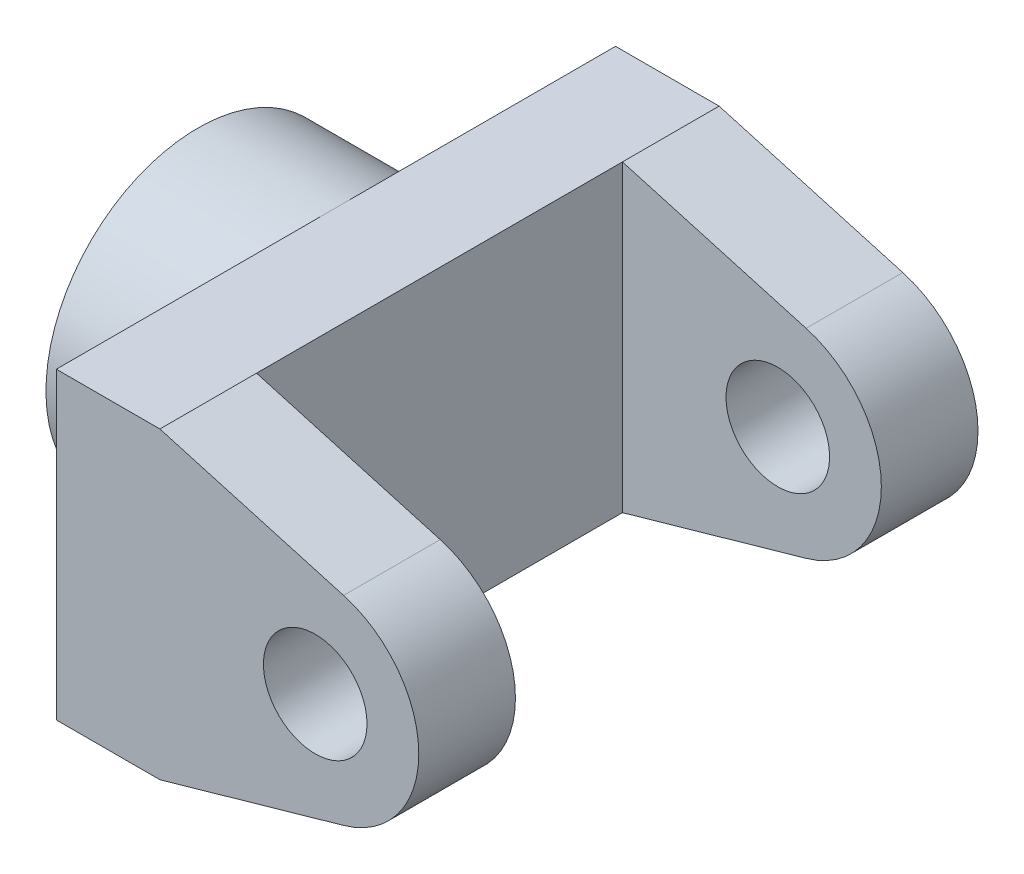
ISO-10303-21;
HEADER;
FILE_DESCRIPTION(('STEP AP214'),'2;1');
FILE_NAME('part.step','',(''),(''),'','','');
FILE_SCHEMA(('AUTOMOTIVE_DESIGN { 1 0 10303 214 1 1 1 1 }'));
ENDSEC;
DATA;
#1=APPLICATION_CONTEXT('core data for automotive mechanical design processes');
#2=APPLICATION_PROTOCOL_DEFINITION('international standard','automotive_design',2000,#1);
#3=PRODUCT_CONTEXT('',#1,'mechanical');
#4=PRODUCT('Part','Part','',(#3));
#5=PRODUCT_RELATED_PRODUCT_CATEGORY('part','',(#4));
#6=PRODUCT_DEFINITION_FORMATION('','',#4);
#7=PRODUCT_DEFINITION_CONTEXT('part definition',#1,'design');
#8=PRODUCT_DEFINITION('design','',#6,#7);
#9=PRODUCT_DEFINITION_SHAPE('','',#8);
#10=(LENGTH_UNIT() NAMED_UNIT(*) SI_UNIT(.MILLI.,.METRE.));
#11=(NAMED_UNIT(*) PLANE_ANGLE_UNIT() SI_UNIT($,.RADIAN.));
#12=(NAMED_UNIT(*) SI_UNIT($,.STERADIAN.) SOLID_ANGLE_UNIT());
#13=UNCERTAINTY_MEASURE_WITH_UNIT(LENGTH_MEASURE(1.E-05),#10,'distance_accuracy_value','');
#14=(GEOMETRIC_REPRESENTATION_CONTEXT(3) GLOBAL_UNCERTAINTY_ASSIGNED_CONTEXT((#13)) GLOBAL_UNIT_ASSIGNED_CONTEXT((#10,
#11,#12)) REPRESENTATION_CONTEXT('',''));
#15=CARTESIAN_POINT('',(0.,0.,0.));
#16=DIRECTION('',(0.,0.,1.));
#17=DIRECTION('',(1.,0.,0.));
#18=AXIS2_PLACEMENT_3D('',#15,#16,#17);
#19=CARTESIAN_POINT('',(-61.2064341570642,0.,107.796179541723));
#20=DIRECTION('',(-1.,0.,0.));
#21=DIRECTION('',(0.,-1.,0.));
#22=AXIS2_PLACEMENT_3D('',#19,#20,#21);
#23=PLANE('',#22);
#24=CARTESIAN_POINT('',(-61.2064341570642,0.,81.066179541723));
#25=DIRECTION('',(-1.,0.,0.));
#26=DIRECTION('',(0.,-1.,0.));
#27=AXIS2_PLACEMENT_3D('',#24,#25,#26);
#28=CIRCLE('',#27,14.52);
#29=CARTESIAN_POINT('',(-61.2064341570642,-14.52,81.066179541723));
#30=VERTEX_POINT('',#29);
#31=CARTESIAN_POINT('',(-61.2064341570642,14.52,81.066179541723));
#32=VERTEX_POINT('',#31);
#33=EDGE_CURVE('E48',#30,#32,#28,.T.);
#34=ORIENTED_EDGE('',*,*,#33,.F.);
#35=DIRECTION('',(0.,0.,-1.));
#36=VECTOR('',#35,1.);
#37=CARTESIAN_POINT('',(-61.2064341570642,-14.52,107.796179541723));
#38=LINE('',#37,#36);
#39=CARTESIAN_POINT('',(-61.2064341570642,-14.52,107.796179541723));
#40=VERTEX_POINT('',#39);
#41=EDGE_CURVE('E274',#40,#30,#38,.T.);
#42=ORIENTED_EDGE('',*,*,#41,.F.);
#43=DIRECTION('',(0.,1.,0.));
#44=VECTOR('',#43,1.);
#45=CARTESIAN_POINT('',(-61.2064341570642,0.,107.796179541723));
#46=LINE('',#45,#44);
#47=CARTESIAN_POINT('',(-61.2064341570642,14.52,107.796179541723));
#48=VERTEX_POINT('',#47);
#49=EDGE_CURVE('E242',#40,#48,#46,.T.);
#50=ORIENTED_EDGE('',*,*,#49,.T.);
#51=DIRECTION('',(0.,0.,-1.));
#52=VECTOR('',#51,1.);
#53=CARTESIAN_POINT('',(-61.2064341570642,14.52,107.796179541723));
#54=LINE('',#53,#52);
#55=EDGE_CURVE('E277',#48,#32,#54,.T.);
#56=ORIENTED_EDGE('',*,*,#55,.T.);
#57=EDGE_LOOP('',(#34,#42,#50,#56));
#58=FACE_BOUND('',#57,.T.);
#59=ADVANCED_FACE('F37',(#58),#23,.T.);
#60=CARTESIAN_POINT('',(-33.7462250281148,-9.52180479097105,107.796179541723));
#61=DIRECTION('',(-0.273758497873683,0.961798463734448,0.));
#62=DIRECTION('',(-0.961798463734448,-0.273758497873683,0.));
#63=AXIS2_PLACEMENT_3D('',#60,#61,#62);
#64=PLANE('',#63);
#65=DIRECTION('',(0.,0.,-1.));
#66=VECTOR('',#65,1.);
#67=CARTESIAN_POINT('',(-51.3064341570642,-14.52,107.796179541723));
#68=LINE('',#67,#66);
#69=CARTESIAN_POINT('',(-51.3064341570642,-14.52,107.796179541723));
#70=VERTEX_POINT('',#69);
#71=CARTESIAN_POINT('',(-51.3064341570642,-14.52,98.556179541723));
#72=VERTEX_POINT('',#71);
#73=EDGE_CURVE('E270',#70,#72,#68,.T.);
#74=ORIENTED_EDGE('',*,*,#73,.T.);
#75=DIRECTION('',(0.961798463734448,0.273758497873683,0.));
#76=VECTOR('',#75,1.);
#77=CARTESIAN_POINT('',(-33.7462250281148,-9.52180479097105,98.556179541723));
#78=LINE('',#77,#76);
#79=CARTESIAN_POINT('',(-33.7462250281148,-9.52180479097105,98.556179541723));
#80=VERTEX_POINT('',#79);
#81=EDGE_CURVE('E226',#72,#80,#78,.T.);
#82=ORIENTED_EDGE('',*,*,#81,.T.);
#83=DIRECTION('',(0.,0.,-1.));
#84=VECTOR('',#83,1.);
#85=CARTESIAN_POINT('',(-33.7462250281148,-9.52180479097105,107.796179541723));
#86=LINE('',#85,#84);
#87=CARTESIAN_POINT('',(-33.7462250281148,-9.52180479097105,107.796179541723));
#88=VERTEX_POINT('',#87);
#89=EDGE_CURVE('E46',#88,#80,#86,.T.);
#90=ORIENTED_EDGE('',*,*,#89,.F.);
#91=DIRECTION('',(0.961798463734448,0.273758497873683,0.));
#92=VECTOR('',#91,1.);
#93=CARTESIAN_POINT('',(-33.7462250281148,-9.52180479097105,107.796179541723));
#94=LINE('',#93,#92);
#95=EDGE_CURVE('E230',#70,#88,#94,.T.);
#96=ORIENTED_EDGE('',*,*,#95,.F.);
#97=EDGE_LOOP('',(#74,#82,#90,#96));
#98=FACE_BOUND('',#97,.T.);
#99=ADVANCED_FACE('F320',(#98),#64,.F.);
#100=CARTESIAN_POINT('',(-36.4564341570642,0.,107.796179541723));
#101=DIRECTION('',(0.,0.,-1.));
#102=DIRECTION('',(-1.,0.,0.));
#103=AXIS2_PLACEMENT_3D('',#100,#101,#102);
#104=CYLINDRICAL_SURFACE('',#103,9.9);
#105=CARTESIAN_POINT('',(-36.4564341570642,0.,98.556179541723));
#106=DIRECTION('',(0.,0.,1.));
#107=DIRECTION('',(1.,0.,0.));
#108=AXIS2_PLACEMENT_3D('',#105,#106,#107);
#109=CIRCLE('',#108,9.9);
#110=CARTESIAN_POINT('',(-33.7462250281148,9.52180479097103,98.556179541723));
#111=VERTEX_POINT('',#110);
#112=EDGE_CURVE('E224',#80,#111,#109,.T.);
#113=ORIENTED_EDGE('',*,*,#112,.T.);
#114=DIRECTION('',(0.,0.,-1.));
#115=VECTOR('',#114,1.);
#116=CARTESIAN_POINT('',(-33.7462250281148,9.52180479097103,107.796179541723));
#117=LINE('',#116,#115);
#118=CARTESIAN_POINT('',(-33.7462250281148,9.52180479097103,107.796179541723));
#119=VERTEX_POINT('',#118);
#120=EDGE_CURVE('E285',#119,#111,#117,.T.);
#121=ORIENTED_EDGE('',*,*,#120,.F.);
#122=CARTESIAN_POINT('',(-36.4564341570642,0.,107.796179541723));
#123=DIRECTION('',(0.,0.,1.));
#124=DIRECTION('',(1.,0.,0.));
#125=AXIS2_PLACEMENT_3D('',#122,#123,#124);
#126=CIRCLE('',#125,9.9);
#127=EDGE_CURVE('E233',#88,#119,#126,.T.);
#128=ORIENTED_EDGE('',*,*,#127,.F.);
#129=ORIENTED_EDGE('',*,*,#89,.T.);
#130=EDGE_LOOP('',(#113,#121,#128,#129));
#131=FACE_BOUND('',#130,.T.);
#132=ADVANCED_FACE('F328',(#131),#104,.T.);
#133=CARTESIAN_POINT('',(-33.7462250281148,9.52180479097103,107.796179541723));
#134=DIRECTION('',(0.273758497873682,0.961798463734448,0.));
#135=DIRECTION('',(-0.961798463734448,0.273758497873682,0.));
#136=AXIS2_PLACEMENT_3D('',#133,#134,#135);
#137=PLANE('',#136);
#138=DIRECTION('',(0.961798463734448,-0.273758497873682,0.));
#139=VECTOR('',#138,1.);
#140=CARTESIAN_POINT('',(-33.7462250281148,9.52180479097103,98.556179541723));
#141=LINE('',#140,#139);
#142=CARTESIAN_POINT('',(-51.3064341570642,14.52,98.556179541723));
#143=VERTEX_POINT('',#142);
#144=EDGE_CURVE('E221',#143,#111,#141,.T.);
#145=ORIENTED_EDGE('',*,*,#144,.F.);
#146=DIRECTION('',(0.,0.,-1.));
#147=VECTOR('',#146,1.);
#148=CARTESIAN_POINT('',(-51.3064341570642,14.52,107.796179541723));
#149=LINE('',#148,#147);
#150=CARTESIAN_POINT('',(-51.3064341570642,14.52,107.796179541723));
#151=VERTEX_POINT('',#150);
#152=EDGE_CURVE('E281',#151,#143,#149,.T.);
#153=ORIENTED_EDGE('',*,*,#152,.F.);
#154=DIRECTION('',(0.961798463734448,-0.273758497873682,0.));
#155=VECTOR('',#154,1.);
#156=CARTESIAN_POINT('',(-33.7462250281148,9.52180479097103,107.796179541723));
#157=LINE('',#156,#155);
#158=EDGE_CURVE('E236',#151,#119,#157,.T.);
#159=ORIENTED_EDGE('',*,*,#158,.T.);
#160=ORIENTED_EDGE('',*,*,#120,.T.);
#161=EDGE_LOOP('',(#145,#153,#159,#160));
#162=FACE_BOUND('',#161,.T.);
#163=ADVANCED_FACE('F351',(#162),#137,.T.);
#164=CARTESIAN_POINT('',(-36.4564341570642,0.,107.796179541723));
#165=DIRECTION('',(0.,0.,-1.));
#166=DIRECTION('',(-1.,0.,0.));
#167=AXIS2_PLACEMENT_3D('',#164,#165,#166);
#168=CYLINDRICAL_SURFACE('',#167,4.95);
#169=CARTESIAN_POINT('',(-36.4564341570642,0.,98.556179541723));
#170=DIRECTION('',(0.,0.,1.));
#171=DIRECTION('',(1.,0.,0.));
#172=AXIS2_PLACEMENT_3D('',#169,#170,#171);
#173=CIRCLE('',#172,4.95);
#174=CARTESIAN_POINT('',(-31.5064341570642,0.,98.556179541723));
#175=VERTEX_POINT('',#174);
#176=EDGE_CURVE('E41',#175,#175,#173,.T.);
#177=ORIENTED_EDGE('',*,*,#176,.F.);
#178=EDGE_LOOP('',(#177));
#179=FACE_BOUND('',#178,.T.);
#180=CARTESIAN_POINT('',(-36.4564341570642,0.,107.796179541723));
#181=DIRECTION('',(0.,0.,1.));
#182=DIRECTION('',(1.,0.,0.));
#183=AXIS2_PLACEMENT_3D('',#180,#181,#182);
#184=CIRCLE('',#183,4.95);
#185=CARTESIAN_POINT('',(-31.5064341570642,0.,107.796179541723));
#186=VERTEX_POINT('',#185);
#187=EDGE_CURVE('E247',#186,#186,#184,.T.);
#188=ORIENTED_EDGE('',*,*,#187,.T.);
#189=EDGE_LOOP('',(#188));
#190=FACE_BOUND('',#189,.T.);
#191=ADVANCED_FACE('F302',(#179,#190),#168,.F.);
#192=CARTESIAN_POINT('',(-33.7462250281148,-9.52180479097105,63.576179541723));
#193=VERTEX_POINT('',#192);
#194=CARTESIAN_POINT('',(-33.7462250281148,-9.52180479097105,54.336179541723));
#195=VERTEX_POINT('',#194);
#196=EDGE_CURVE('E288',#193,#195,#86,.T.);
#197=ORIENTED_EDGE('',*,*,#196,.F.);
#198=DIRECTION('',(-0.961798463734448,-0.273758497873683,0.));
#199=VECTOR('',#198,1.);
#200=CARTESIAN_POINT('',(-33.7462250281148,-9.52180479097105,63.576179541723));
#201=LINE('',#200,#199);
#202=CARTESIAN_POINT('',(-51.3064341570642,-14.52,63.576179541723));
#203=VERTEX_POINT('',#202);
#204=EDGE_CURVE('E218',#193,#203,#201,.T.);
#205=ORIENTED_EDGE('',*,*,#204,.T.);
#206=CARTESIAN_POINT('',(-51.3064341570642,-14.52,54.336179541723));
#207=VERTEX_POINT('',#206);
#208=EDGE_CURVE('E250',#203,#207,#68,.T.);
#209=ORIENTED_EDGE('',*,*,#208,.T.);
#210=DIRECTION('',(0.961798463734448,0.273758497873683,0.));
#211=VECTOR('',#210,1.);
#212=CARTESIAN_POINT('',(-33.7462250281148,-9.52180479097105,54.336179541723));
#213=LINE('',#212,#211);
#214=EDGE_CURVE('E229',#207,#195,#213,.T.);
#215=ORIENTED_EDGE('',*,*,#214,.T.);
#216=EDGE_LOOP('',(#197,#205,#209,#215));
#217=FACE_BOUND('',#216,.T.);
#218=ADVANCED_FACE('F39',(#217),#64,.F.);
#219=CARTESIAN_POINT('',(-33.7462250281148,9.52180479097103,63.576179541723));
#220=VERTEX_POINT('',#219);
#221=CARTESIAN_POINT('',(-33.7462250281148,9.52180479097103,54.336179541723));
#222=VERTEX_POINT('',#221);
#223=EDGE_CURVE('E284',#220,#222,#117,.T.);
#224=ORIENTED_EDGE('',*,*,#223,.F.);
#225=CARTESIAN_POINT('',(-36.4564341570642,0.,63.576179541723));
#226=DIRECTION('',(0.,0.,-1.));
#227=DIRECTION('',(-1.,0.,0.));
#228=AXIS2_PLACEMENT_3D('',#225,#226,#227);
#229=CIRCLE('',#228,9.9);
#230=EDGE_CURVE('E215',#220,#193,#229,.T.);
#231=ORIENTED_EDGE('',*,*,#230,.T.);
#232=ORIENTED_EDGE('',*,*,#196,.T.);
#233=CARTESIAN_POINT('',(-36.4564341570642,0.,54.336179541723));
#234=DIRECTION('',(0.,0.,1.));
#235=DIRECTION('',(1.,0.,0.));
#236=AXIS2_PLACEMENT_3D('',#233,#234,#235);
#237=CIRCLE('',#236,9.9);
#238=EDGE_CURVE('E253',#195,#222,#237,.T.);
#239=ORIENTED_EDGE('',*,*,#238,.T.);
#240=EDGE_LOOP('',(#224,#231,#232,#239));
#241=FACE_BOUND('',#240,.T.);
#242=ADVANCED_FACE('F348',(#241),#104,.T.);
#243=DIRECTION('',(-0.961798463734448,0.273758497873682,0.));
#244=VECTOR('',#243,1.);
#245=CARTESIAN_POINT('',(-33.7462250281148,9.52180479097103,63.576179541723));
#246=LINE('',#245,#244);
#247=CARTESIAN_POINT('',(-51.3064341570642,14.52,63.576179541723));
#248=VERTEX_POINT('',#247);
#249=EDGE_CURVE('E213',#220,#248,#246,.T.);
#250=ORIENTED_EDGE('',*,*,#249,.F.);
#251=ORIENTED_EDGE('',*,*,#223,.T.);
#252=DIRECTION('',(0.961798463734448,-0.273758497873682,0.));
#253=VECTOR('',#252,1.);
#254=CARTESIAN_POINT('',(-33.7462250281148,9.52180479097103,54.336179541723));
#255=LINE('',#254,#253);
#256=CARTESIAN_POINT('',(-51.3064341570642,14.52,54.336179541723));
#257=VERTEX_POINT('',#256);
#258=EDGE_CURVE('E256',#257,#222,#255,.T.);
#259=ORIENTED_EDGE('',*,*,#258,.F.);
#260=EDGE_CURVE('E280',#248,#257,#149,.T.);
#261=ORIENTED_EDGE('',*,*,#260,.F.);
#262=EDGE_LOOP('',(#250,#251,#259,#261));
#263=FACE_BOUND('',#262,.T.);
#264=ADVANCED_FACE('F343',(#263),#137,.T.);
#265=CARTESIAN_POINT('',(-36.4564341570642,14.52,107.796179541723));
#266=DIRECTION('',(0.,1.,0.));
#267=DIRECTION('',(-1.,0.,0.));
#268=AXIS2_PLACEMENT_3D('',#265,#266,#267);
#269=PLANE('',#268);
#270=DIRECTION('',(1.,0.,0.));
#271=VECTOR('',#270,1.);
#272=CARTESIAN_POINT('',(-36.4564341570642,14.52,54.336179541723));
#273=LINE('',#272,#271);
#274=CARTESIAN_POINT('',(-61.2064341570642,14.52,54.336179541723));
#275=VERTEX_POINT('',#274);
#276=EDGE_CURVE('E259',#275,#257,#273,.T.);
#277=ORIENTED_EDGE('',*,*,#276,.F.);
#278=EDGE_CURVE('E276',#32,#275,#54,.T.);
#279=ORIENTED_EDGE('',*,*,#278,.F.);
#280=ORIENTED_EDGE('',*,*,#55,.F.);
#281=DIRECTION('',(1.,0.,0.));
#282=VECTOR('',#281,1.);
#283=CARTESIAN_POINT('',(-36.4564341570642,14.52,107.796179541723));
#284=LINE('',#283,#282);
#285=EDGE_CURVE('E239',#48,#151,#284,.T.);
#286=ORIENTED_EDGE('',*,*,#285,.T.);
#287=ORIENTED_EDGE('',*,*,#152,.T.);
#288=DIRECTION('',(0.,0.,-1.));
#289=VECTOR('',#288,1.);
#290=CARTESIAN_POINT('',(-51.3064341570642,14.52,98.556179541723));
#291=LINE('',#290,#289);
#292=EDGE_CURVE('E203',#143,#248,#291,.T.);
#293=ORIENTED_EDGE('',*,*,#292,.T.);
#294=ORIENTED_EDGE('',*,*,#260,.T.);
#295=EDGE_LOOP('',(#277,#279,#280,#286,#287,#293,#294));
#296=FACE_BOUND('',#295,.T.);
#297=ADVANCED_FACE('F337',(#296),#269,.T.);
#298=EDGE_CURVE('E11',#32,#30,#28,.T.);
#299=ORIENTED_EDGE('',*,*,#298,.F.);
#300=ORIENTED_EDGE('',*,*,#278,.T.);
#301=DIRECTION('',(0.,1.,0.));
#302=VECTOR('',#301,1.);
#303=CARTESIAN_POINT('',(-61.2064341570642,0.,54.336179541723));
#304=LINE('',#303,#302);
#305=CARTESIAN_POINT('',(-61.2064341570642,-14.52,54.336179541723));
#306=VERTEX_POINT('',#305);
#307=EDGE_CURVE('E262',#306,#275,#304,.T.);
#308=ORIENTED_EDGE('',*,*,#307,.F.);
#309=EDGE_CURVE('E273',#30,#306,#38,.T.);
#310=ORIENTED_EDGE('',*,*,#309,.F.);
#311=EDGE_LOOP('',(#299,#300,#308,#310));
#312=FACE_BOUND('',#311,.T.);
#313=ADVANCED_FACE('F324',(#312),#23,.T.);
#314=CARTESIAN_POINT('',(-36.4564341570642,-14.52,107.796179541723));
#315=DIRECTION('',(0.,1.,0.));
#316=DIRECTION('',(-1.,0.,0.));
#317=AXIS2_PLACEMENT_3D('',#314,#315,#316);
#318=PLANE('',#317);
#319=DIRECTION('',(1.,0.,0.));
#320=VECTOR('',#319,1.);
#321=CARTESIAN_POINT('',(-36.4564341570642,-14.52,54.336179541723));
#322=LINE('',#321,#320);
#323=EDGE_CURVE('E265',#306,#207,#322,.T.);
#324=ORIENTED_EDGE('',*,*,#323,.T.);
#325=ORIENTED_EDGE('',*,*,#208,.F.);
#326=DIRECTION('',(0.,0.,-1.));
#327=VECTOR('',#326,1.);
#328=CARTESIAN_POINT('',(-51.3064341570642,-14.52,98.556179541723));
#329=LINE('',#328,#327);
#330=EDGE_CURVE('E200',#72,#203,#329,.T.);
#331=ORIENTED_EDGE('',*,*,#330,.F.);
#332=ORIENTED_EDGE('',*,*,#73,.F.);
#333=DIRECTION('',(1.,0.,0.));
#334=VECTOR('',#333,1.);
#335=CARTESIAN_POINT('',(-36.4564341570642,-14.52,107.796179541723));
#336=LINE('',#335,#334);
#337=EDGE_CURVE('E245',#40,#70,#336,.T.);
#338=ORIENTED_EDGE('',*,*,#337,.F.);
#339=ORIENTED_EDGE('',*,*,#41,.T.);
#340=ORIENTED_EDGE('',*,*,#309,.T.);
#341=EDGE_LOOP('',(#324,#325,#331,#332,#338,#339,#340));
#342=FACE_BOUND('',#341,.T.);
#343=ADVANCED_FACE('F300',(#342),#318,.F.);
#344=CARTESIAN_POINT('',(-36.4564341570642,0.,63.576179541723));
#345=DIRECTION('',(0.,0.,-1.));
#346=DIRECTION('',(-1.,0.,0.));
#347=AXIS2_PLACEMENT_3D('',#344,#345,#346);
#348=CIRCLE('',#347,4.95);
#349=CARTESIAN_POINT('',(-41.4064341570642,0.,63.576179541723));
#350=VERTEX_POINT('',#349);
#351=EDGE_CURVE('E211',#350,#350,#348,.T.);
#352=ORIENTED_EDGE('',*,*,#351,.F.);
#353=EDGE_LOOP('',(#352));
#354=FACE_BOUND('',#353,.T.);
#355=CARTESIAN_POINT('',(-36.4564341570642,0.,54.336179541723));
#356=DIRECTION('',(0.,0.,1.));
#357=DIRECTION('',(1.,0.,0.));
#358=AXIS2_PLACEMENT_3D('',#355,#356,#357);
#359=CIRCLE('',#358,4.95);
#360=CARTESIAN_POINT('',(-31.5064341570642,0.,54.336179541723));
#361=VERTEX_POINT('',#360);
#362=EDGE_CURVE('E234',#361,#361,#359,.T.);
#363=ORIENTED_EDGE('',*,*,#362,.F.);
#364=EDGE_LOOP('',(#363));
#365=FACE_BOUND('',#364,.T.);
#366=ADVANCED_FACE('F296',(#354,#365),#168,.F.);
#367=CARTESIAN_POINT('',(-36.4564341570642,0.,107.796179541723));
#368=DIRECTION('',(0.,0.,1.));
#369=DIRECTION('',(1.,0.,0.));
#370=AXIS2_PLACEMENT_3D('',#367,#368,#369);
#371=PLANE('',#370);
#372=ORIENTED_EDGE('',*,*,#95,.T.);
#373=ORIENTED_EDGE('',*,*,#127,.T.);
#374=ORIENTED_EDGE('',*,*,#158,.F.);
#375=ORIENTED_EDGE('',*,*,#285,.F.);
#376=ORIENTED_EDGE('',*,*,#49,.F.);
#377=ORIENTED_EDGE('',*,*,#337,.T.);
#378=EDGE_LOOP('',(#372,#373,#374,#375,#376,#377));
#379=FACE_BOUND('',#378,.T.);
#380=ORIENTED_EDGE('',*,*,#187,.F.);
#381=EDGE_LOOP('',(#380));
#382=FACE_BOUND('',#381,.T.);
#383=ADVANCED_FACE('F299',(#379,#382),#371,.T.);
#384=CARTESIAN_POINT('',(-36.4564341570642,0.,54.336179541723));
#385=DIRECTION('',(0.,0.,1.));
#386=DIRECTION('',(1.,0.,0.));
#387=AXIS2_PLACEMENT_3D('',#384,#385,#386);
#388=PLANE('',#387);
#389=ORIENTED_EDGE('',*,*,#214,.F.);
#390=ORIENTED_EDGE('',*,*,#323,.F.);
#391=ORIENTED_EDGE('',*,*,#307,.T.);
#392=ORIENTED_EDGE('',*,*,#276,.T.);
#393=ORIENTED_EDGE('',*,*,#258,.T.);
#394=ORIENTED_EDGE('',*,*,#238,.F.);
#395=EDGE_LOOP('',(#389,#390,#391,#392,#393,#394));
#396=FACE_BOUND('',#395,.T.);
#397=ORIENTED_EDGE('',*,*,#362,.T.);
#398=EDGE_LOOP('',(#397));
#399=FACE_BOUND('',#398,.T.);
#400=ADVANCED_FACE('F305',(#396,#399),#388,.F.);
#401=CARTESIAN_POINT('',(-51.3064341570642,14.52,98.556179541723));
#402=DIRECTION('',(0.,0.,1.));
#403=DIRECTION('',(1.,0.,0.));
#404=AXIS2_PLACEMENT_3D('',#401,#402,#403);
#405=PLANE('',#404);
#406=ORIENTED_EDGE('',*,*,#176,.T.);
#407=EDGE_LOOP('',(#406));
#408=FACE_BOUND('',#407,.T.);
#409=DIRECTION('',(0.,-1.,0.));
#410=VECTOR('',#409,1.);
#411=CARTESIAN_POINT('',(-51.3064341570642,14.52,98.556179541723));
#412=LINE('',#411,#410);
#413=EDGE_CURVE('E209',#143,#72,#412,.T.);
#414=ORIENTED_EDGE('',*,*,#413,.F.);
#415=ORIENTED_EDGE('',*,*,#144,.T.);
#416=ORIENTED_EDGE('',*,*,#112,.F.);
#417=ORIENTED_EDGE('',*,*,#81,.F.);
#418=EDGE_LOOP('',(#414,#415,#416,#417));
#419=FACE_BOUND('',#418,.T.);
#420=ADVANCED_FACE('F307',(#408,#419),#405,.F.);
#421=CARTESIAN_POINT('',(-51.3064341570642,14.52,63.576179541723));
#422=DIRECTION('',(0.,0.,-1.));
#423=DIRECTION('',(-1.,0.,0.));
#424=AXIS2_PLACEMENT_3D('',#421,#422,#423);
#425=PLANE('',#424);
#426=ORIENTED_EDGE('',*,*,#351,.T.);
#427=EDGE_LOOP('',(#426));
#428=FACE_BOUND('',#427,.T.);
#429=ORIENTED_EDGE('',*,*,#230,.F.);
#430=ORIENTED_EDGE('',*,*,#249,.T.);
#431=DIRECTION('',(0.,-1.,0.));
#432=VECTOR('',#431,1.);
#433=CARTESIAN_POINT('',(-51.3064341570642,14.52,63.576179541723));
#434=LINE('',#433,#432);
#435=EDGE_CURVE('E206',#248,#203,#434,.T.);
#436=ORIENTED_EDGE('',*,*,#435,.T.);
#437=ORIENTED_EDGE('',*,*,#204,.F.);
#438=EDGE_LOOP('',(#429,#430,#436,#437));
#439=FACE_BOUND('',#438,.T.);
#440=ADVANCED_FACE('F293',(#428,#439),#425,.F.);
#441=CARTESIAN_POINT('',(-51.3064341570642,14.52,98.556179541723));
#442=DIRECTION('',(-1.,0.,0.));
#443=DIRECTION('',(0.,-1.,0.));
#444=AXIS2_PLACEMENT_3D('',#441,#442,#443);
#445=PLANE('',#444);
#446=ORIENTED_EDGE('',*,*,#330,.T.);
#447=ORIENTED_EDGE('',*,*,#435,.F.);
#448=ORIENTED_EDGE('',*,*,#292,.F.);
#449=ORIENTED_EDGE('',*,*,#413,.T.);
#450=EDGE_LOOP('',(#446,#447,#448,#449));
#451=FACE_BOUND('',#450,.T.);
#452=ADVANCED_FACE('F388',(#451),#445,.F.);
#453=CARTESIAN_POINT('',(-74.4064341570642,0.,81.066179541723));
#454=DIRECTION('',(-1.,0.,0.));
#455=DIRECTION('',(0.,-1.,0.));
#456=AXIS2_PLACEMENT_3D('',#453,#454,#455);
#457=PLANE('',#456);
#458=DIRECTION('',(0.,0.,-1.));
#459=VECTOR('',#458,1.);
#460=CARTESIAN_POINT('',(-74.4064341570642,1.31999999999998,54.336179541723));
#461=LINE('',#460,#459);
#462=CARTESIAN_POINT('',(-74.4064341570642,1.31999999999999,72.922464173416));
#463=VERTEX_POINT('',#462);
#464=CARTESIAN_POINT('',(-74.4064341570642,1.31999999999999,70.8589710611576));
#465=VERTEX_POINT('',#464);
#466=EDGE_CURVE('E174',#463,#465,#461,.T.);
#467=ORIENTED_EDGE('',*,*,#466,.F.);
#468=CARTESIAN_POINT('',(-74.4064341570642,0.,81.066179541723));
#469=DIRECTION('',(-1.,0.,0.));
#470=DIRECTION('',(0.,-1.,0.));
#471=AXIS2_PLACEMENT_3D('',#468,#469,#470);
#472=CIRCLE('',#471,8.25);
#473=CARTESIAN_POINT('',(-74.4064341570642,-1.32000000000001,72.922464173416));
#474=VERTEX_POINT('',#473);
#475=EDGE_CURVE('E192',#474,#463,#472,.T.);
#476=ORIENTED_EDGE('',*,*,#475,.F.);
#477=DIRECTION('',(0.,0.,-1.));
#478=VECTOR('',#477,1.);
#479=CARTESIAN_POINT('',(-74.4064341570642,-1.32000000000002,54.336179541723));
#480=LINE('',#479,#478);
#481=CARTESIAN_POINT('',(-74.4064341570642,-1.32000000000001,70.8589710611576));
#482=VERTEX_POINT('',#481);
#483=EDGE_CURVE('E177',#474,#482,#480,.T.);
#484=ORIENTED_EDGE('',*,*,#483,.T.);
#485=DIRECTION('',(0.,1.,0.));
#486=VECTOR('',#485,1.);
#487=CARTESIAN_POINT('',(-74.4064341570642,0.,70.8589710611576));
#488=LINE('',#487,#486);
#489=EDGE_CURVE('E166',#482,#465,#488,.T.);
#490=ORIENTED_EDGE('',*,*,#489,.T.);
#491=EDGE_LOOP('',(#467,#476,#484,#490));
#492=FACE_BOUND('',#491,.T.);
#493=CARTESIAN_POINT('',(-74.4064341570642,0.,81.066179541723));
#494=DIRECTION('',(-1.,0.,0.));
#495=DIRECTION('',(0.,-1.,0.));
#496=AXIS2_PLACEMENT_3D('',#493,#494,#495);
#497=CIRCLE('',#496,14.52);
#498=CARTESIAN_POINT('',(-74.4064341570642,-14.52,81.066179541723));
#499=VERTEX_POINT('',#498);
#500=EDGE_CURVE('E198',#499,#499,#497,.T.);
#501=ORIENTED_EDGE('',*,*,#500,.T.);
#502=EDGE_LOOP('',(#501));
#503=FACE_BOUND('',#502,.T.);
#504=ADVANCED_FACE('F379',(#492,#503),#457,.T.);
#505=CARTESIAN_POINT('',(-74.4064341570642,0.,81.066179541723));
#506=DIRECTION('',(1.,0.,0.));
#507=DIRECTION('',(0.,1.,0.));
#508=AXIS2_PLACEMENT_3D('',#505,#506,#507);
#509=CYLINDRICAL_SURFACE('',#508,14.52);
#510=ORIENTED_EDGE('',*,*,#500,.F.);
#511=EDGE_LOOP('',(#510));
#512=FACE_BOUND('',#511,.T.);
#513=ORIENTED_EDGE('',*,*,#33,.T.);
#514=ORIENTED_EDGE('',*,*,#298,.T.);
#515=EDGE_LOOP('',(#513,#514));
#516=FACE_BOUND('',#515,.T.);
#517=ADVANCED_FACE('F377',(#512,#516),#509,.T.);
#518=CARTESIAN_POINT('',(-74.4064341570642,0.,81.066179541723));
#519=DIRECTION('',(1.,0.,0.));
#520=DIRECTION('',(0.,1.,0.));
#521=AXIS2_PLACEMENT_3D('',#518,#519,#520);
#522=CYLINDRICAL_SURFACE('',#521,8.25);
#523=DIRECTION('',(-1.,0.,0.));
#524=VECTOR('',#523,1.);
#525=CARTESIAN_POINT('',(-54.6064341570642,1.31999999999999,72.922464173416));
#526=LINE('',#525,#524);
#527=CARTESIAN_POINT('',(-61.2064341570642,1.31999999999999,72.922464173416));
#528=VERTEX_POINT('',#527);
#529=EDGE_CURVE('E190',#528,#463,#526,.T.);
#530=ORIENTED_EDGE('',*,*,#529,.F.);
#531=CARTESIAN_POINT('',(-61.2064341570642,0.,81.066179541723));
#532=DIRECTION('',(-1.,0.,0.));
#533=DIRECTION('',(0.,-1.,0.));
#534=AXIS2_PLACEMENT_3D('',#531,#532,#533);
#535=CIRCLE('',#534,8.25);
#536=CARTESIAN_POINT('',(-61.2064341570642,-1.32000000000001,72.922464173416));
#537=VERTEX_POINT('',#536);
#538=EDGE_CURVE('E186',#537,#528,#535,.T.);
#539=ORIENTED_EDGE('',*,*,#538,.F.);
#540=DIRECTION('',(-1.,0.,0.));
#541=VECTOR('',#540,1.);
#542=CARTESIAN_POINT('',(-54.6064341570642,-1.32000000000001,72.922464173416));
#543=LINE('',#542,#541);
#544=EDGE_CURVE('E168',#537,#474,#543,.T.);
#545=ORIENTED_EDGE('',*,*,#544,.T.);
#546=ORIENTED_EDGE('',*,*,#475,.T.);
#547=EDGE_LOOP('',(#530,#539,#545,#546));
#548=FACE_BOUND('',#547,.T.);
#549=ADVANCED_FACE('F334',(#548),#522,.F.);
#550=EDGE_CURVE('E195',#528,#537,#535,.T.);
#551=ORIENTED_EDGE('',*,*,#550,.T.);
#552=ORIENTED_EDGE('',*,*,#538,.T.);
#553=EDGE_LOOP('',(#551,#552));
#554=FACE_BOUND('',#553,.T.);
#555=ADVANCED_FACE('F323',(#554),#23,.T.);
#556=CARTESIAN_POINT('',(-54.6064341570642,0.,70.8589710611576));
#557=DIRECTION('',(0.,0.,1.));
#558=DIRECTION('',(1.,0.,0.));
#559=AXIS2_PLACEMENT_3D('',#556,#557,#558);
#560=PLANE('',#559);
#561=ORIENTED_EDGE('',*,*,#489,.F.);
#562=DIRECTION('',(-1.,0.,0.));
#563=VECTOR('',#562,1.);
#564=CARTESIAN_POINT('',(-54.6064341570642,-1.32000000000001,70.8589710611576));
#565=LINE('',#564,#563);
#566=CARTESIAN_POINT('',(-54.6064341570642,-1.32000000000001,70.8589710611576));
#567=VERTEX_POINT('',#566);
#568=EDGE_CURVE('E154',#567,#482,#565,.T.);
#569=ORIENTED_EDGE('',*,*,#568,.F.);
#570=DIRECTION('',(0.,1.,0.));
#571=VECTOR('',#570,1.);
#572=CARTESIAN_POINT('',(-54.6064341570642,0.,70.8589710611576));
#573=LINE('',#572,#571);
#574=CARTESIAN_POINT('',(-54.6064341570642,1.31999999999999,70.8589710611576));
#575=VERTEX_POINT('',#574);
#576=EDGE_CURVE('E160',#567,#575,#573,.T.);
#577=ORIENTED_EDGE('',*,*,#576,.T.);
#578=DIRECTION('',(-1.,0.,0.));
#579=VECTOR('',#578,1.);
#580=CARTESIAN_POINT('',(-54.6064341570642,1.31999999999999,70.8589710611576));
#581=LINE('',#580,#579);
#582=EDGE_CURVE('E184',#575,#465,#581,.T.);
#583=ORIENTED_EDGE('',*,*,#582,.T.);
#584=EDGE_LOOP('',(#561,#569,#577,#583));
#585=FACE_BOUND('',#584,.T.);
#586=ADVANCED_FACE('F163',(#585),#560,.T.);
#587=CARTESIAN_POINT('',(-54.6064341570642,1.31999999999999,54.336179541723));
#588=DIRECTION('',(0.,1.,0.));
#589=DIRECTION('',(-1.,0.,0.));
#590=AXIS2_PLACEMENT_3D('',#587,#588,#589);
#591=PLANE('',#590);
#592=ORIENTED_EDGE('',*,*,#466,.T.);
#593=ORIENTED_EDGE('',*,*,#582,.F.);
#594=DIRECTION('',(0.,0.,-1.));
#595=VECTOR('',#594,1.);
#596=CARTESIAN_POINT('',(-54.6064341570642,1.31999999999999,54.336179541723));
#597=LINE('',#596,#595);
#598=CARTESIAN_POINT('',(-54.6064341570642,1.31999999999999,72.922464173416));
#599=VERTEX_POINT('',#598);
#600=EDGE_CURVE('E169',#599,#575,#597,.T.);
#601=ORIENTED_EDGE('',*,*,#600,.F.);
#602=EDGE_CURVE('E187',#599,#528,#526,.T.);
#603=ORIENTED_EDGE('',*,*,#602,.T.);
#604=ORIENTED_EDGE('',*,*,#529,.T.);
#605=EDGE_LOOP('',(#592,#593,#601,#603,#604));
#606=FACE_BOUND('',#605,.T.);
#607=ADVANCED_FACE('F444',(#606),#591,.F.);
#608=CARTESIAN_POINT('',(-54.6064341570642,0.,81.066179541723));
#609=DIRECTION('',(-1.,0.,0.));
#610=DIRECTION('',(0.,-1.,0.));
#611=AXIS2_PLACEMENT_3D('',#608,#609,#610);
#612=CYLINDRICAL_SURFACE('',#611,8.25);
#613=ORIENTED_EDGE('',*,*,#550,.F.);
#614=ORIENTED_EDGE('',*,*,#602,.F.);
#615=CARTESIAN_POINT('',(-54.6064341570642,0.,81.066179541723));
#616=DIRECTION('',(-1.,0.,0.));
#617=DIRECTION('',(0.,-1.,0.));
#618=AXIS2_PLACEMENT_3D('',#615,#616,#617);
#619=CIRCLE('',#618,8.25);
#620=CARTESIAN_POINT('',(-54.6064341570642,-1.32000000000001,72.922464173416));
#621=VERTEX_POINT('',#620);
#622=EDGE_CURVE('E159',#621,#599,#619,.F.);
#623=ORIENTED_EDGE('',*,*,#622,.F.);
#624=EDGE_CURVE('E55',#621,#537,#543,.T.);
#625=ORIENTED_EDGE('',*,*,#624,.T.);
#626=EDGE_LOOP('',(#613,#614,#623,#625));
#627=FACE_BOUND('',#626,.T.);
#628=ADVANCED_FACE('F453',(#627),#612,.T.);
#629=CARTESIAN_POINT('',(-54.6064341570642,-1.32000000000001,54.336179541723));
#630=DIRECTION('',(0.,1.,0.));
#631=DIRECTION('',(-1.,0.,0.));
#632=AXIS2_PLACEMENT_3D('',#629,#630,#631);
#633=PLANE('',#632);
#634=ORIENTED_EDGE('',*,*,#483,.F.);
#635=ORIENTED_EDGE('',*,*,#544,.F.);
#636=ORIENTED_EDGE('',*,*,#624,.F.);
#637=DIRECTION('',(0.,0.,-1.));
#638=VECTOR('',#637,1.);
#639=CARTESIAN_POINT('',(-54.6064341570642,-1.32000000000001,54.336179541723));
#640=LINE('',#639,#638);
#641=EDGE_CURVE('E151',#621,#567,#640,.T.);
#642=ORIENTED_EDGE('',*,*,#641,.T.);
#643=ORIENTED_EDGE('',*,*,#568,.T.);
#644=EDGE_LOOP('',(#634,#635,#636,#642,#643));
#645=FACE_BOUND('',#644,.T.);
#646=ADVANCED_FACE('F153',(#645),#633,.T.);
#647=CARTESIAN_POINT('',(-54.6064341570642,0.,54.336179541723));
#648=DIRECTION('',(-1.,0.,0.));
#649=DIRECTION('',(0.,-1.,0.));
#650=AXIS2_PLACEMENT_3D('',#647,#648,#649);
#651=PLANE('',#650);
#652=ORIENTED_EDGE('',*,*,#576,.F.);
#653=ORIENTED_EDGE('',*,*,#641,.F.);
#654=ORIENTED_EDGE('',*,*,#622,.T.);
#655=ORIENTED_EDGE('',*,*,#600,.T.);
#656=EDGE_LOOP('',(#652,#653,#654,#655));
#657=FACE_BOUND('',#656,.T.);
#658=ADVANCED_FACE('F172',(#657),#651,.T.);
#659=CLOSED_SHELL('',(#59,#99,#132,#163,#191,#218,#242,#264,#297,#313,#343,#366,#383,#400,#420,
#440,#452,#504,#517,#549,#555,#586,#607,#628,#646,#658));
#660=MANIFOLD_SOLID_BREP('B2',#659);
#661=ADVANCED_BREP_SHAPE_REPRESENTATION('',(#18,#660),#14);
#662=SHAPE_DEFINITION_REPRESENTATION(#9,#661);
ENDSEC;
END-ISO-10303-21;
